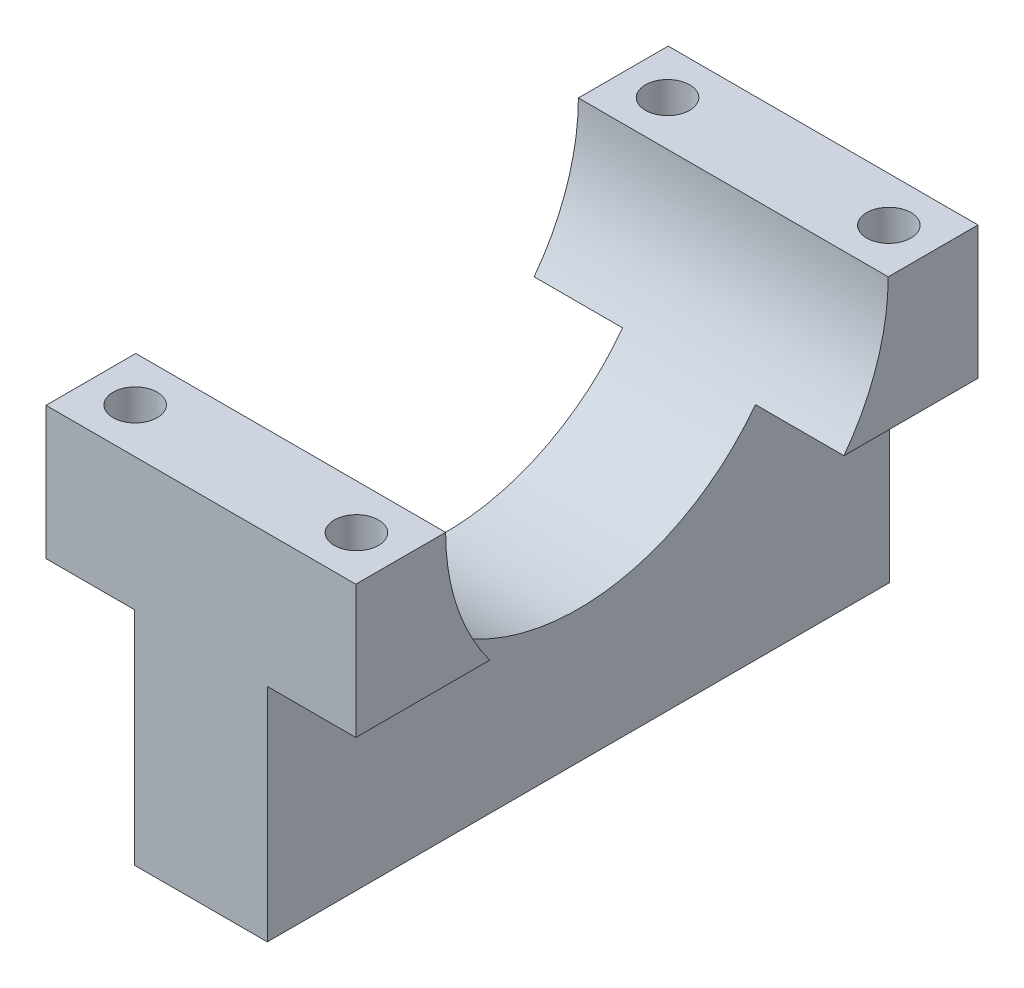
ISO-10303-21;
HEADER;
FILE_DESCRIPTION(('STEP AP214'),'2;1');
FILE_NAME('part.step','',(''),(''),'','','');
FILE_SCHEMA(('AUTOMOTIVE_DESIGN { 1 0 10303 214 1 1 1 1 }'));
ENDSEC;
DATA;
#1=APPLICATION_CONTEXT('core data for automotive mechanical design processes');
#2=APPLICATION_PROTOCOL_DEFINITION('international standard','automotive_design',2000,#1);
#3=PRODUCT_CONTEXT('',#1,'mechanical');
#4=PRODUCT('Part','Part','',(#3));
#5=PRODUCT_RELATED_PRODUCT_CATEGORY('part','',(#4));
#6=PRODUCT_DEFINITION_FORMATION('','',#4);
#7=PRODUCT_DEFINITION_CONTEXT('part definition',#1,'design');
#8=PRODUCT_DEFINITION('design','',#6,#7);
#9=PRODUCT_DEFINITION_SHAPE('','',#8);
#10=(LENGTH_UNIT() NAMED_UNIT(*) SI_UNIT(.MILLI.,.METRE.));
#11=(NAMED_UNIT(*) PLANE_ANGLE_UNIT() SI_UNIT($,.RADIAN.));
#12=(NAMED_UNIT(*) SI_UNIT($,.STERADIAN.) SOLID_ANGLE_UNIT());
#13=UNCERTAINTY_MEASURE_WITH_UNIT(LENGTH_MEASURE(1.E-05),#10,'distance_accuracy_value','');
#14=(GEOMETRIC_REPRESENTATION_CONTEXT(3) GLOBAL_UNCERTAINTY_ASSIGNED_CONTEXT((#13)) GLOBAL_UNIT_ASSIGNED_CONTEXT((#10,
#11,#12)) REPRESENTATION_CONTEXT('',''));
#15=CARTESIAN_POINT('',(0.,0.,0.));
#16=DIRECTION('',(0.,0.,1.));
#17=DIRECTION('',(1.,0.,0.));
#18=AXIS2_PLACEMENT_3D('',#15,#16,#17);
#19=CARTESIAN_POINT('',(-55.425,0.,47.5887300509317));
#20=DIRECTION('',(0.,1.,0.));
#21=DIRECTION('',(0.,0.,1.));
#22=AXIS2_PLACEMENT_3D('',#19,#20,#21);
#23=CYLINDRICAL_SURFACE('',#22,1.25);
#24=CARTESIAN_POINT('',(-55.425,57.25,47.5887300509317));
#25=DIRECTION('',(0.,-1.,0.));
#26=DIRECTION('',(0.,0.,-1.));
#27=AXIS2_PLACEMENT_3D('',#24,#25,#26);
#28=CIRCLE('',#27,1.25);
#29=CARTESIAN_POINT('',(-55.425,57.25,46.3387300509317));
#30=VERTEX_POINT('',#29);
#31=EDGE_CURVE('E164',#30,#30,#28,.F.);
#32=ORIENTED_EDGE('',*,*,#31,.F.);
#33=EDGE_LOOP('',(#32));
#34=FACE_BOUND('',#33,.T.);
#35=CARTESIAN_POINT('',(-55.425,64.75,47.5887300509317));
#36=DIRECTION('',(0.,-1.,0.));
#37=DIRECTION('',(0.,0.,-1.));
#38=AXIS2_PLACEMENT_3D('',#35,#36,#37);
#39=CIRCLE('',#38,1.25);
#40=CARTESIAN_POINT('',(-55.425,64.75,46.3387300509317));
#41=VERTEX_POINT('',#40);
#42=EDGE_CURVE('E168',#41,#41,#39,.T.);
#43=ORIENTED_EDGE('',*,*,#42,.F.);
#44=EDGE_LOOP('',(#43));
#45=FACE_BOUND('',#44,.T.);
#46=ADVANCED_FACE('F34',(#34,#45),#23,.F.);
#47=CARTESIAN_POINT('',(-67.925,0.,47.5887300509317));
#48=DIRECTION('',(0.,1.,0.));
#49=DIRECTION('',(0.,0.,1.));
#50=AXIS2_PLACEMENT_3D('',#47,#48,#49);
#51=CYLINDRICAL_SURFACE('',#50,1.25);
#52=CARTESIAN_POINT('',(-67.925,64.75,47.5887300509317));
#53=DIRECTION('',(0.,1.,0.));
#54=DIRECTION('',(0.,0.,-1.));
#55=AXIS2_PLACEMENT_3D('',#52,#53,#54);
#56=CIRCLE('',#55,1.25);
#57=CARTESIAN_POINT('',(-67.925,64.75,46.3387300509317));
#58=VERTEX_POINT('',#57);
#59=EDGE_CURVE('E172',#58,#58,#56,.T.);
#60=ORIENTED_EDGE('',*,*,#59,.T.);
#61=EDGE_LOOP('',(#60));
#62=FACE_BOUND('',#61,.T.);
#63=CARTESIAN_POINT('',(-67.925,57.25,47.5887300509317));
#64=DIRECTION('',(0.,1.,0.));
#65=DIRECTION('',(0.,0.,1.));
#66=AXIS2_PLACEMENT_3D('',#63,#64,#65);
#67=CIRCLE('',#66,1.25);
#68=CARTESIAN_POINT('',(-67.925,57.25,48.8387300509317));
#69=VERTEX_POINT('',#68);
#70=EDGE_CURVE('E169',#69,#69,#67,.T.);
#71=ORIENTED_EDGE('',*,*,#70,.F.);
#72=EDGE_LOOP('',(#71));
#73=FACE_BOUND('',#72,.T.);
#74=ADVANCED_FACE('F325',(#62,#73),#51,.F.);
#75=CARTESIAN_POINT('',(-67.925,0.,77.6612699490683));
#76=DIRECTION('',(0.,1.,0.));
#77=DIRECTION('',(0.,0.,1.));
#78=AXIS2_PLACEMENT_3D('',#75,#76,#77);
#79=CYLINDRICAL_SURFACE('',#78,1.25);
#80=CARTESIAN_POINT('',(-67.925,57.25,77.6612699490683));
#81=DIRECTION('',(0.,-1.,0.));
#82=DIRECTION('',(0.,0.,-1.));
#83=AXIS2_PLACEMENT_3D('',#80,#81,#82);
#84=CIRCLE('',#83,1.25);
#85=CARTESIAN_POINT('',(-67.925,57.25,76.4112699490683));
#86=VERTEX_POINT('',#85);
#87=EDGE_CURVE('E173',#86,#86,#84,.F.);
#88=ORIENTED_EDGE('',*,*,#87,.F.);
#89=EDGE_LOOP('',(#88));
#90=FACE_BOUND('',#89,.T.);
#91=CARTESIAN_POINT('',(-67.925,64.75,77.6612699490683));
#92=DIRECTION('',(0.,-1.,0.));
#93=DIRECTION('',(0.,0.,1.));
#94=AXIS2_PLACEMENT_3D('',#91,#92,#93);
#95=CIRCLE('',#94,1.25);
#96=CARTESIAN_POINT('',(-67.925,64.75,78.9112699490683));
#97=VERTEX_POINT('',#96);
#98=EDGE_CURVE('E176',#97,#97,#95,.T.);
#99=ORIENTED_EDGE('',*,*,#98,.F.);
#100=EDGE_LOOP('',(#99));
#101=FACE_BOUND('',#100,.T.);
#102=ADVANCED_FACE('F333',(#90,#101),#79,.F.);
#103=CARTESIAN_POINT('',(-55.425,0.,77.6612699490683));
#104=DIRECTION('',(0.,1.,0.));
#105=DIRECTION('',(0.,0.,1.));
#106=AXIS2_PLACEMENT_3D('',#103,#104,#105);
#107=CYLINDRICAL_SURFACE('',#106,1.25);
#108=CARTESIAN_POINT('',(-55.425,64.75,77.6612699490683));
#109=DIRECTION('',(0.,1.,0.));
#110=DIRECTION('',(0.,0.,1.));
#111=AXIS2_PLACEMENT_3D('',#108,#109,#110);
#112=CIRCLE('',#111,1.25);
#113=CARTESIAN_POINT('',(-55.425,64.75,78.9112699490683));
#114=VERTEX_POINT('',#113);
#115=EDGE_CURVE('E276',#114,#114,#112,.T.);
#116=ORIENTED_EDGE('',*,*,#115,.T.);
#117=EDGE_LOOP('',(#116));
#118=FACE_BOUND('',#117,.T.);
#119=CARTESIAN_POINT('',(-55.425,57.25,77.6612699490683));
#120=DIRECTION('',(0.,1.,0.));
#121=DIRECTION('',(0.,0.,1.));
#122=AXIS2_PLACEMENT_3D('',#119,#120,#121);
#123=CIRCLE('',#122,1.25);
#124=CARTESIAN_POINT('',(-55.425,57.25,78.9112699490683));
#125=VERTEX_POINT('',#124);
#126=EDGE_CURVE('E38',#125,#125,#123,.T.);
#127=ORIENTED_EDGE('',*,*,#126,.F.);
#128=EDGE_LOOP('',(#127));
#129=FACE_BOUND('',#128,.T.);
#130=ADVANCED_FACE('F344',(#118,#129),#107,.F.);
#131=CARTESIAN_POINT('',(-52.925,57.25,45.0524601018634));
#132=DIRECTION('',(0.,-1.,0.));
#133=DIRECTION('',(0.,0.,-1.));
#134=AXIS2_PLACEMENT_3D('',#131,#132,#133);
#135=PLANE('',#134);
#136=ORIENTED_EDGE('',*,*,#31,.T.);
#137=EDGE_LOOP('',(#136));
#138=FACE_BOUND('',#137,.T.);
#139=DIRECTION('',(0.,0.,1.));
#140=VECTOR('',#139,1.);
#141=CARTESIAN_POINT('',(-57.925,57.25,45.0524601018634));
#142=LINE('',#141,#140);
#143=CARTESIAN_POINT('',(-57.925,57.25,45.0524601018634));
#144=VERTEX_POINT('',#143);
#145=CARTESIAN_POINT('',(-57.925,57.25,52.625));
#146=VERTEX_POINT('',#145);
#147=EDGE_CURVE('E167',#144,#146,#142,.T.);
#148=ORIENTED_EDGE('',*,*,#147,.F.);
#149=DIRECTION('',(-1.,0.,0.));
#150=VECTOR('',#149,1.);
#151=CARTESIAN_POINT('',(-52.925,57.25,45.0524601018634));
#152=LINE('',#151,#150);
#153=CARTESIAN_POINT('',(-52.925,57.25,45.0524601018634));
#154=VERTEX_POINT('',#153);
#155=EDGE_CURVE('E240',#154,#144,#152,.T.);
#156=ORIENTED_EDGE('',*,*,#155,.F.);
#157=DIRECTION('',(0.,0.,1.));
#158=VECTOR('',#157,1.);
#159=CARTESIAN_POINT('',(-52.925,57.25,45.0524601018634));
#160=LINE('',#159,#158);
#161=CARTESIAN_POINT('',(-52.925,57.25,52.625));
#162=VERTEX_POINT('',#161);
#163=EDGE_CURVE('E237',#154,#162,#160,.T.);
#164=ORIENTED_EDGE('',*,*,#163,.T.);
#165=DIRECTION('',(-1.,0.,0.));
#166=VECTOR('',#165,1.);
#167=CARTESIAN_POINT('',(-52.925,57.25,52.625));
#168=LINE('',#167,#166);
#169=EDGE_CURVE('E245',#162,#146,#168,.T.);
#170=ORIENTED_EDGE('',*,*,#169,.T.);
#171=EDGE_LOOP('',(#148,#156,#164,#170));
#172=FACE_BOUND('',#171,.T.);
#173=ADVANCED_FACE('F289',(#138,#172),#135,.T.);
#174=CARTESIAN_POINT('',(-52.925,64.7500000000001,62.6250000000002));
#175=DIRECTION('',(-1.,0.,0.));
#176=DIRECTION('',(0.,0.,-1.));
#177=AXIS2_PLACEMENT_3D('',#174,#175,#176);
#178=PLANE('',#177);
#179=DIRECTION('',(0.,-1.,0.));
#180=VECTOR('',#179,1.);
#181=CARTESIAN_POINT('',(-52.925,64.75,45.0524601018634));
#182=LINE('',#181,#180);
#183=CARTESIAN_POINT('',(-52.925,64.75,45.0524601018634));
#184=VERTEX_POINT('',#183);
#185=EDGE_CURVE('E228',#184,#154,#182,.T.);
#186=ORIENTED_EDGE('',*,*,#185,.F.);
#187=DIRECTION('',(0.,0.,-1.));
#188=VECTOR('',#187,1.);
#189=CARTESIAN_POINT('',(-52.925,64.75,45.0524601018634));
#190=LINE('',#189,#188);
#191=CARTESIAN_POINT('',(-52.925,64.75,50.125));
#192=VERTEX_POINT('',#191);
#193=EDGE_CURVE('E231',#192,#184,#190,.T.);
#194=ORIENTED_EDGE('',*,*,#193,.F.);
#195=CARTESIAN_POINT('',(-52.925,64.7500000000001,62.6250000000002));
#196=DIRECTION('',(1.,0.,0.));
#197=DIRECTION('',(0.,0.,-1.));
#198=AXIS2_PLACEMENT_3D('',#195,#196,#197);
#199=CIRCLE('',#198,12.5000000000002);
#200=EDGE_CURVE('E234',#162,#192,#199,.T.);
#201=ORIENTED_EDGE('',*,*,#200,.F.);
#202=ORIENTED_EDGE('',*,*,#163,.F.);
#203=EDGE_LOOP('',(#186,#194,#201,#202));
#204=FACE_BOUND('',#203,.T.);
#205=ADVANCED_FACE('F295',(#204),#178,.F.);
#206=CARTESIAN_POINT('',(0.,64.75,0.));
#207=DIRECTION('',(0.,-1.,0.));
#208=DIRECTION('',(0.,0.,1.));
#209=AXIS2_PLACEMENT_3D('',#206,#207,#208);
#210=PLANE('',#209);
#211=ORIENTED_EDGE('',*,*,#59,.F.);
#212=EDGE_LOOP('',(#211));
#213=FACE_BOUND('',#212,.T.);
#214=ORIENTED_EDGE('',*,*,#42,.T.);
#215=EDGE_LOOP('',(#214));
#216=FACE_BOUND('',#215,.T.);
#217=DIRECTION('',(1.,0.,0.));
#218=VECTOR('',#217,1.);
#219=CARTESIAN_POINT('',(-70.425,64.75,50.125));
#220=LINE('',#219,#218);
#221=CARTESIAN_POINT('',(-70.425,64.75,50.125));
#222=VERTEX_POINT('',#221);
#223=EDGE_CURVE('E11',#192,#222,#220,.F.);
#224=ORIENTED_EDGE('',*,*,#223,.F.);
#225=ORIENTED_EDGE('',*,*,#193,.T.);
#226=DIRECTION('',(1.,0.,0.));
#227=VECTOR('',#226,1.);
#228=CARTESIAN_POINT('',(-65.425,64.75,45.0524601018634));
#229=LINE('',#228,#227);
#230=CARTESIAN_POINT('',(-70.425,64.75,45.0524601018634));
#231=VERTEX_POINT('',#230);
#232=EDGE_CURVE('E252',#231,#184,#229,.T.);
#233=ORIENTED_EDGE('',*,*,#232,.F.);
#234=DIRECTION('',(0.,0.,-1.));
#235=VECTOR('',#234,1.);
#236=CARTESIAN_POINT('',(-70.425,64.75,45.0524601018634));
#237=LINE('',#236,#235);
#238=EDGE_CURVE('E215',#222,#231,#237,.T.);
#239=ORIENTED_EDGE('',*,*,#238,.F.);
#240=EDGE_LOOP('',(#224,#225,#233,#239));
#241=FACE_BOUND('',#240,.T.);
#242=ADVANCED_FACE('F297',(#213,#216,#241),#210,.F.);
#243=CARTESIAN_POINT('',(-70.425,64.7500000000001,62.6250000000002));
#244=DIRECTION('',(1.,0.,0.));
#245=DIRECTION('',(0.,0.,-1.));
#246=AXIS2_PLACEMENT_3D('',#243,#244,#245);
#247=PLANE('',#246);
#248=DIRECTION('',(0.,-1.,0.));
#249=VECTOR('',#248,1.);
#250=CARTESIAN_POINT('',(-70.425,64.75,45.0524601018634));
#251=LINE('',#250,#249);
#252=CARTESIAN_POINT('',(-70.425,57.25,45.0524601018634));
#253=VERTEX_POINT('',#252);
#254=EDGE_CURVE('E207',#231,#253,#251,.T.);
#255=ORIENTED_EDGE('',*,*,#254,.T.);
#256=DIRECTION('',(0.,0.,1.));
#257=VECTOR('',#256,1.);
#258=CARTESIAN_POINT('',(-70.425,57.25,45.0524601018634));
#259=LINE('',#258,#257);
#260=CARTESIAN_POINT('',(-70.425,57.25,52.625));
#261=VERTEX_POINT('',#260);
#262=EDGE_CURVE('E210',#253,#261,#259,.T.);
#263=ORIENTED_EDGE('',*,*,#262,.T.);
#264=CARTESIAN_POINT('',(-70.425,64.7500000000001,62.6250000000002));
#265=DIRECTION('',(1.,0.,0.));
#266=DIRECTION('',(0.,0.,-1.));
#267=AXIS2_PLACEMENT_3D('',#264,#265,#266);
#268=CIRCLE('',#267,12.5000000000002);
#269=EDGE_CURVE('E212',#261,#222,#268,.T.);
#270=ORIENTED_EDGE('',*,*,#269,.T.);
#271=ORIENTED_EDGE('',*,*,#238,.T.);
#272=EDGE_LOOP('',(#255,#263,#270,#271));
#273=FACE_BOUND('',#272,.T.);
#274=ADVANCED_FACE('F301',(#273),#247,.F.);
#275=CARTESIAN_POINT('',(-70.425,57.25,45.0524601018634));
#276=DIRECTION('',(0.,1.,0.));
#277=DIRECTION('',(0.,0.,1.));
#278=AXIS2_PLACEMENT_3D('',#275,#276,#277);
#279=PLANE('',#278);
#280=ORIENTED_EDGE('',*,*,#70,.T.);
#281=EDGE_LOOP('',(#280));
#282=FACE_BOUND('',#281,.T.);
#283=DIRECTION('',(0.,0.,1.));
#284=VECTOR('',#283,1.);
#285=CARTESIAN_POINT('',(-65.425,57.25,45.0524601018634));
#286=LINE('',#285,#284);
#287=CARTESIAN_POINT('',(-65.425,57.25,45.0524601018634));
#288=VERTEX_POINT('',#287);
#289=CARTESIAN_POINT('',(-65.425,57.25,52.625));
#290=VERTEX_POINT('',#289);
#291=EDGE_CURVE('E171',#288,#290,#286,.T.);
#292=ORIENTED_EDGE('',*,*,#291,.T.);
#293=DIRECTION('',(1.,0.,0.));
#294=VECTOR('',#293,1.);
#295=CARTESIAN_POINT('',(-70.425,57.25,52.625));
#296=LINE('',#295,#294);
#297=EDGE_CURVE('E218',#261,#290,#296,.T.);
#298=ORIENTED_EDGE('',*,*,#297,.F.);
#299=ORIENTED_EDGE('',*,*,#262,.F.);
#300=DIRECTION('',(1.,0.,0.));
#301=VECTOR('',#300,1.);
#302=CARTESIAN_POINT('',(-70.425,57.25,45.0524601018634));
#303=LINE('',#302,#301);
#304=EDGE_CURVE('E223',#253,#288,#303,.T.);
#305=ORIENTED_EDGE('',*,*,#304,.T.);
#306=EDGE_LOOP('',(#292,#298,#299,#305));
#307=FACE_BOUND('',#306,.T.);
#308=ADVANCED_FACE('F306',(#282,#307),#279,.F.);
#309=CARTESIAN_POINT('',(-70.425,64.75,62.625));
#310=DIRECTION('',(1.,0.,0.));
#311=DIRECTION('',(0.,0.,-1.));
#312=AXIS2_PLACEMENT_3D('',#309,#310,#311);
#313=CYLINDRICAL_SURFACE('',#312,12.5);
#314=ORIENTED_EDGE('',*,*,#223,.T.);
#315=ORIENTED_EDGE('',*,*,#269,.F.);
#316=ORIENTED_EDGE('',*,*,#297,.T.);
#317=CARTESIAN_POINT('',(-65.425,64.75,62.625));
#318=DIRECTION('',(-1.,0.,0.));
#319=DIRECTION('',(0.,0.,1.));
#320=AXIS2_PLACEMENT_3D('',#317,#318,#319);
#321=CIRCLE('',#320,12.5);
#322=CARTESIAN_POINT('',(-65.425,57.25,72.625));
#323=VERTEX_POINT('',#322);
#324=EDGE_CURVE('E250',#323,#290,#321,.F.);
#325=ORIENTED_EDGE('',*,*,#324,.F.);
#326=DIRECTION('',(1.,0.,0.));
#327=VECTOR('',#326,1.);
#328=CARTESIAN_POINT('',(-70.425,57.25,72.625));
#329=LINE('',#328,#327);
#330=CARTESIAN_POINT('',(-70.425,57.25,72.625));
#331=VERTEX_POINT('',#330);
#332=EDGE_CURVE('E202',#331,#323,#329,.T.);
#333=ORIENTED_EDGE('',*,*,#332,.F.);
#334=CARTESIAN_POINT('',(-70.425,64.7500000000001,62.6249999999998));
#335=DIRECTION('',(-1.,0.,0.));
#336=DIRECTION('',(0.,0.,1.));
#337=AXIS2_PLACEMENT_3D('',#334,#335,#336);
#338=CIRCLE('',#337,12.5000000000002);
#339=CARTESIAN_POINT('',(-70.425,64.75,75.125));
#340=VERTEX_POINT('',#339);
#341=EDGE_CURVE('E195',#331,#340,#338,.T.);
#342=ORIENTED_EDGE('',*,*,#341,.T.);
#343=DIRECTION('',(1.,0.,0.));
#344=VECTOR('',#343,1.);
#345=CARTESIAN_POINT('',(-70.425,64.75,75.125));
#346=LINE('',#345,#344);
#347=CARTESIAN_POINT('',(-52.925,64.75,75.125));
#348=VERTEX_POINT('',#347);
#349=EDGE_CURVE('E43',#340,#348,#346,.T.);
#350=ORIENTED_EDGE('',*,*,#349,.T.);
#351=CARTESIAN_POINT('',(-52.925,64.7500000000001,62.6249999999998));
#352=DIRECTION('',(-1.,0.,0.));
#353=DIRECTION('',(0.,0.,1.));
#354=AXIS2_PLACEMENT_3D('',#351,#352,#353);
#355=CIRCLE('',#354,12.5000000000002);
#356=CARTESIAN_POINT('',(-52.925,57.25,72.625));
#357=VERTEX_POINT('',#356);
#358=EDGE_CURVE('E267',#357,#348,#355,.T.);
#359=ORIENTED_EDGE('',*,*,#358,.F.);
#360=DIRECTION('',(-1.,0.,0.));
#361=VECTOR('',#360,1.);
#362=CARTESIAN_POINT('',(-52.925,57.25,72.625));
#363=LINE('',#362,#361);
#364=CARTESIAN_POINT('',(-57.925,57.25,72.625));
#365=VERTEX_POINT('',#364);
#366=EDGE_CURVE('E187',#357,#365,#363,.T.);
#367=ORIENTED_EDGE('',*,*,#366,.T.);
#368=CARTESIAN_POINT('',(-57.925,64.75,62.625));
#369=DIRECTION('',(-1.,0.,0.));
#370=DIRECTION('',(0.,0.,1.));
#371=AXIS2_PLACEMENT_3D('',#368,#369,#370);
#372=CIRCLE('',#371,12.5);
#373=EDGE_CURVE('E248',#146,#365,#372,.T.);
#374=ORIENTED_EDGE('',*,*,#373,.F.);
#375=ORIENTED_EDGE('',*,*,#169,.F.);
#376=ORIENTED_EDGE('',*,*,#200,.T.);
#377=EDGE_LOOP('',(#314,#315,#316,#325,#333,#342,#350,#359,#367,#374,#375,#376));
#378=FACE_BOUND('',#377,.T.);
#379=ADVANCED_FACE('F282',(#378),#313,.F.);
#380=CARTESIAN_POINT('',(-70.425,57.25,80.1975398981366));
#381=DIRECTION('',(0.,-1.,0.));
#382=DIRECTION('',(0.,0.,-1.));
#383=AXIS2_PLACEMENT_3D('',#380,#381,#382);
#384=PLANE('',#383);
#385=ORIENTED_EDGE('',*,*,#87,.T.);
#386=EDGE_LOOP('',(#385));
#387=FACE_BOUND('',#386,.T.);
#388=DIRECTION('',(0.,0.,-1.));
#389=VECTOR('',#388,1.);
#390=CARTESIAN_POINT('',(-65.425,57.25,80.1975398981366));
#391=LINE('',#390,#389);
#392=CARTESIAN_POINT('',(-65.425,57.25,80.1975398981366));
#393=VERTEX_POINT('',#392);
#394=EDGE_CURVE('E175',#393,#323,#391,.T.);
#395=ORIENTED_EDGE('',*,*,#394,.F.);
#396=DIRECTION('',(1.,0.,0.));
#397=VECTOR('',#396,1.);
#398=CARTESIAN_POINT('',(-70.425,57.25,80.1975398981366));
#399=LINE('',#398,#397);
#400=CARTESIAN_POINT('',(-70.425,57.25,80.1975398981366));
#401=VERTEX_POINT('',#400);
#402=EDGE_CURVE('E153',#401,#393,#399,.T.);
#403=ORIENTED_EDGE('',*,*,#402,.F.);
#404=DIRECTION('',(0.,0.,-1.));
#405=VECTOR('',#404,1.);
#406=CARTESIAN_POINT('',(-70.425,57.25,80.1975398981366));
#407=LINE('',#406,#405);
#408=EDGE_CURVE('E198',#401,#331,#407,.T.);
#409=ORIENTED_EDGE('',*,*,#408,.T.);
#410=ORIENTED_EDGE('',*,*,#332,.T.);
#411=EDGE_LOOP('',(#395,#403,#409,#410));
#412=FACE_BOUND('',#411,.T.);
#413=ADVANCED_FACE('F309',(#387,#412),#384,.T.);
#414=CARTESIAN_POINT('',(-70.425,64.7500000000001,62.6249999999998));
#415=DIRECTION('',(1.,0.,0.));
#416=DIRECTION('',(0.,0.,1.));
#417=AXIS2_PLACEMENT_3D('',#414,#415,#416);
#418=PLANE('',#417);
#419=DIRECTION('',(0.,-1.,0.));
#420=VECTOR('',#419,1.);
#421=CARTESIAN_POINT('',(-70.425,64.75,80.1975398981366));
#422=LINE('',#421,#420);
#423=CARTESIAN_POINT('',(-70.425,64.75,80.1975398981366));
#424=VERTEX_POINT('',#423);
#425=EDGE_CURVE('E179',#424,#401,#422,.T.);
#426=ORIENTED_EDGE('',*,*,#425,.F.);
#427=DIRECTION('',(0.,0.,1.));
#428=VECTOR('',#427,1.);
#429=CARTESIAN_POINT('',(-70.425,64.75,80.1975398981366));
#430=LINE('',#429,#428);
#431=EDGE_CURVE('E192',#340,#424,#430,.T.);
#432=ORIENTED_EDGE('',*,*,#431,.F.);
#433=ORIENTED_EDGE('',*,*,#341,.F.);
#434=ORIENTED_EDGE('',*,*,#408,.F.);
#435=EDGE_LOOP('',(#426,#432,#433,#434));
#436=FACE_BOUND('',#435,.T.);
#437=ADVANCED_FACE('F312',(#436),#418,.F.);
#438=ORIENTED_EDGE('',*,*,#115,.F.);
#439=EDGE_LOOP('',(#438));
#440=FACE_BOUND('',#439,.T.);
#441=ORIENTED_EDGE('',*,*,#98,.T.);
#442=EDGE_LOOP('',(#441));
#443=FACE_BOUND('',#442,.T.);
#444=ORIENTED_EDGE('',*,*,#349,.F.);
#445=ORIENTED_EDGE('',*,*,#431,.T.);
#446=DIRECTION('',(1.,0.,0.));
#447=VECTOR('',#446,1.);
#448=CARTESIAN_POINT('',(-65.425,64.75,80.1975398981366));
#449=LINE('',#448,#447);
#450=CARTESIAN_POINT('',(-52.925,64.75,80.1975398981366));
#451=VERTEX_POINT('',#450);
#452=EDGE_CURVE('E162',#424,#451,#449,.T.);
#453=ORIENTED_EDGE('',*,*,#452,.T.);
#454=DIRECTION('',(0.,0.,1.));
#455=VECTOR('',#454,1.);
#456=CARTESIAN_POINT('',(-52.925,64.75,80.1975398981366));
#457=LINE('',#456,#455);
#458=EDGE_CURVE('E257',#348,#451,#457,.T.);
#459=ORIENTED_EDGE('',*,*,#458,.F.);
#460=EDGE_LOOP('',(#444,#445,#453,#459));
#461=FACE_BOUND('',#460,.T.);
#462=ADVANCED_FACE('F256',(#440,#443,#461),#210,.F.);
#463=CARTESIAN_POINT('',(-52.925,64.7500000000001,62.6249999999998));
#464=DIRECTION('',(-1.,0.,0.));
#465=DIRECTION('',(0.,0.,1.));
#466=AXIS2_PLACEMENT_3D('',#463,#464,#465);
#467=PLANE('',#466);
#468=DIRECTION('',(0.,-1.,0.));
#469=VECTOR('',#468,1.);
#470=CARTESIAN_POINT('',(-52.925,64.75,80.1975398981366));
#471=LINE('',#470,#469);
#472=CARTESIAN_POINT('',(-52.925,57.25,80.1975398981366));
#473=VERTEX_POINT('',#472);
#474=EDGE_CURVE('E265',#451,#473,#471,.T.);
#475=ORIENTED_EDGE('',*,*,#474,.T.);
#476=DIRECTION('',(0.,0.,-1.));
#477=VECTOR('',#476,1.);
#478=CARTESIAN_POINT('',(-52.925,57.25,80.1975398981366));
#479=LINE('',#478,#477);
#480=EDGE_CURVE('E269',#473,#357,#479,.T.);
#481=ORIENTED_EDGE('',*,*,#480,.T.);
#482=ORIENTED_EDGE('',*,*,#358,.T.);
#483=ORIENTED_EDGE('',*,*,#458,.T.);
#484=EDGE_LOOP('',(#475,#481,#482,#483));
#485=FACE_BOUND('',#484,.T.);
#486=ADVANCED_FACE('F264',(#485),#467,.F.);
#487=CARTESIAN_POINT('',(-52.925,57.25,80.1975398981366));
#488=DIRECTION('',(0.,1.,0.));
#489=DIRECTION('',(0.,0.,1.));
#490=AXIS2_PLACEMENT_3D('',#487,#488,#489);
#491=PLANE('',#490);
#492=ORIENTED_EDGE('',*,*,#126,.T.);
#493=EDGE_LOOP('',(#492));
#494=FACE_BOUND('',#493,.T.);
#495=DIRECTION('',(0.,0.,-1.));
#496=VECTOR('',#495,1.);
#497=CARTESIAN_POINT('',(-57.925,57.25,80.1975398981366));
#498=LINE('',#497,#496);
#499=CARTESIAN_POINT('',(-57.925,57.25,80.1975398981366));
#500=VERTEX_POINT('',#499);
#501=EDGE_CURVE('E270',#500,#365,#498,.T.);
#502=ORIENTED_EDGE('',*,*,#501,.T.);
#503=ORIENTED_EDGE('',*,*,#366,.F.);
#504=ORIENTED_EDGE('',*,*,#480,.F.);
#505=DIRECTION('',(-1.,0.,0.));
#506=VECTOR('',#505,1.);
#507=CARTESIAN_POINT('',(-52.925,57.25,80.1975398981366));
#508=LINE('',#507,#506);
#509=EDGE_CURVE('E182',#473,#500,#508,.T.);
#510=ORIENTED_EDGE('',*,*,#509,.T.);
#511=EDGE_LOOP('',(#502,#503,#504,#510));
#512=FACE_BOUND('',#511,.T.);
#513=ADVANCED_FACE('F284',(#494,#512),#491,.F.);
#514=CARTESIAN_POINT('',(-65.425,-35.9364248901641,80.1975398981366));
#515=DIRECTION('',(0.,0.,1.));
#516=DIRECTION('',(1.,0.,0.));
#517=AXIS2_PLACEMENT_3D('',#514,#515,#516);
#518=PLANE('',#517);
#519=DIRECTION('',(-1.,0.,0.));
#520=VECTOR('',#519,1.);
#521=CARTESIAN_POINT('',(-65.425,44.75,80.1975398981366));
#522=LINE('',#521,#520);
#523=CARTESIAN_POINT('',(-57.925,44.75,80.1975398981366));
#524=VERTEX_POINT('',#523);
#525=CARTESIAN_POINT('',(-65.425,44.75,80.1975398981366));
#526=VERTEX_POINT('',#525);
#527=EDGE_CURVE('E134',#524,#526,#522,.T.);
#528=ORIENTED_EDGE('',*,*,#527,.F.);
#529=DIRECTION('',(0.,1.,0.));
#530=VECTOR('',#529,1.);
#531=CARTESIAN_POINT('',(-57.925,-35.9364248901641,80.1975398981366));
#532=LINE('',#531,#530);
#533=EDGE_CURVE('E58',#524,#500,#532,.T.);
#534=ORIENTED_EDGE('',*,*,#533,.T.);
#535=ORIENTED_EDGE('',*,*,#509,.F.);
#536=ORIENTED_EDGE('',*,*,#474,.F.);
#537=ORIENTED_EDGE('',*,*,#452,.F.);
#538=ORIENTED_EDGE('',*,*,#425,.T.);
#539=ORIENTED_EDGE('',*,*,#402,.T.);
#540=DIRECTION('',(0.,1.,0.));
#541=VECTOR('',#540,1.);
#542=CARTESIAN_POINT('',(-65.425,-35.9364248901641,80.1975398981366));
#543=LINE('',#542,#541);
#544=EDGE_CURVE('E145',#526,#393,#543,.T.);
#545=ORIENTED_EDGE('',*,*,#544,.F.);
#546=EDGE_LOOP('',(#528,#534,#535,#536,#537,#538,#539,#545));
#547=FACE_BOUND('',#546,.T.);
#548=ADVANCED_FACE('F151',(#547),#518,.T.);
#549=CARTESIAN_POINT('',(-65.425,-35.9364248901641,45.0524601018634));
#550=DIRECTION('',(-1.,0.,0.));
#551=DIRECTION('',(0.,0.,1.));
#552=AXIS2_PLACEMENT_3D('',#549,#550,#551);
#553=PLANE('',#552);
#554=DIRECTION('',(0.,0.,-1.));
#555=VECTOR('',#554,1.);
#556=CARTESIAN_POINT('',(-65.425,44.75,45.0524601018634));
#557=LINE('',#556,#555);
#558=CARTESIAN_POINT('',(-65.425,44.75,45.0524601018634));
#559=VERTEX_POINT('',#558);
#560=EDGE_CURVE('E137',#526,#559,#557,.T.);
#561=ORIENTED_EDGE('',*,*,#560,.F.);
#562=ORIENTED_EDGE('',*,*,#544,.T.);
#563=ORIENTED_EDGE('',*,*,#394,.T.);
#564=ORIENTED_EDGE('',*,*,#324,.T.);
#565=ORIENTED_EDGE('',*,*,#291,.F.);
#566=DIRECTION('',(0.,1.,0.));
#567=VECTOR('',#566,1.);
#568=CARTESIAN_POINT('',(-65.425,-35.9364248901641,45.0524601018634));
#569=LINE('',#568,#567);
#570=EDGE_CURVE('E148',#559,#288,#569,.T.);
#571=ORIENTED_EDGE('',*,*,#570,.F.);
#572=EDGE_LOOP('',(#561,#562,#563,#564,#565,#571));
#573=FACE_BOUND('',#572,.T.);
#574=ADVANCED_FACE('F143',(#573),#553,.T.);
#575=CARTESIAN_POINT('',(-65.425,-35.9364248901641,45.0524601018634));
#576=DIRECTION('',(0.,0.,1.));
#577=DIRECTION('',(1.,0.,0.));
#578=AXIS2_PLACEMENT_3D('',#575,#576,#577);
#579=PLANE('',#578);
#580=DIRECTION('',(0.,1.,0.));
#581=VECTOR('',#580,1.);
#582=CARTESIAN_POINT('',(-57.925,-35.9364248901641,45.0524601018634));
#583=LINE('',#582,#581);
#584=CARTESIAN_POINT('',(-57.925,44.75,45.0524601018634));
#585=VERTEX_POINT('',#584);
#586=EDGE_CURVE('E157',#585,#144,#583,.T.);
#587=ORIENTED_EDGE('',*,*,#586,.F.);
#588=DIRECTION('',(-1.,0.,0.));
#589=VECTOR('',#588,1.);
#590=CARTESIAN_POINT('',(-65.425,44.75,45.0524601018634));
#591=LINE('',#590,#589);
#592=EDGE_CURVE('E149',#585,#559,#591,.T.);
#593=ORIENTED_EDGE('',*,*,#592,.T.);
#594=ORIENTED_EDGE('',*,*,#570,.T.);
#595=ORIENTED_EDGE('',*,*,#304,.F.);
#596=ORIENTED_EDGE('',*,*,#254,.F.);
#597=ORIENTED_EDGE('',*,*,#232,.T.);
#598=ORIENTED_EDGE('',*,*,#185,.T.);
#599=ORIENTED_EDGE('',*,*,#155,.T.);
#600=EDGE_LOOP('',(#587,#593,#594,#595,#596,#597,#598,#599));
#601=FACE_BOUND('',#600,.T.);
#602=ADVANCED_FACE('F353',(#601),#579,.F.);
#603=CARTESIAN_POINT('',(-57.925,-35.9364248901641,45.0524601018634));
#604=DIRECTION('',(-1.,0.,0.));
#605=DIRECTION('',(0.,0.,1.));
#606=AXIS2_PLACEMENT_3D('',#603,#604,#605);
#607=PLANE('',#606);
#608=ORIENTED_EDGE('',*,*,#533,.F.);
#609=DIRECTION('',(0.,0.,-1.));
#610=VECTOR('',#609,1.);
#611=CARTESIAN_POINT('',(-57.925,44.75,45.0524601018634));
#612=LINE('',#611,#610);
#613=EDGE_CURVE('E51',#524,#585,#612,.T.);
#614=ORIENTED_EDGE('',*,*,#613,.T.);
#615=ORIENTED_EDGE('',*,*,#586,.T.);
#616=ORIENTED_EDGE('',*,*,#147,.T.);
#617=ORIENTED_EDGE('',*,*,#373,.T.);
#618=ORIENTED_EDGE('',*,*,#501,.F.);
#619=EDGE_LOOP('',(#608,#614,#615,#616,#617,#618));
#620=FACE_BOUND('',#619,.T.);
#621=ADVANCED_FACE('F36',(#620),#607,.F.);
#622=CARTESIAN_POINT('',(0.,44.75,0.));
#623=DIRECTION('',(0.,1.,0.));
#624=DIRECTION('',(0.,0.,1.));
#625=AXIS2_PLACEMENT_3D('',#622,#623,#624);
#626=PLANE('',#625);
#627=ORIENTED_EDGE('',*,*,#527,.T.);
#628=ORIENTED_EDGE('',*,*,#560,.T.);
#629=ORIENTED_EDGE('',*,*,#592,.F.);
#630=ORIENTED_EDGE('',*,*,#613,.F.);
#631=EDGE_LOOP('',(#627,#628,#629,#630));
#632=FACE_BOUND('',#631,.T.);
#633=ADVANCED_FACE('F136',(#632),#626,.F.);
#634=CLOSED_SHELL('',(#46,#74,#102,#130,#173,#205,#242,#274,#308,#379,#413,#437,#462,#486,#513,
#548,#574,#602,#621,#633));
#635=MANIFOLD_SOLID_BREP('B2',#634);
#636=ADVANCED_BREP_SHAPE_REPRESENTATION('',(#18,#635),#14);
#637=SHAPE_DEFINITION_REPRESENTATION(#9,#636);
ENDSEC;
END-ISO-10303-21;
